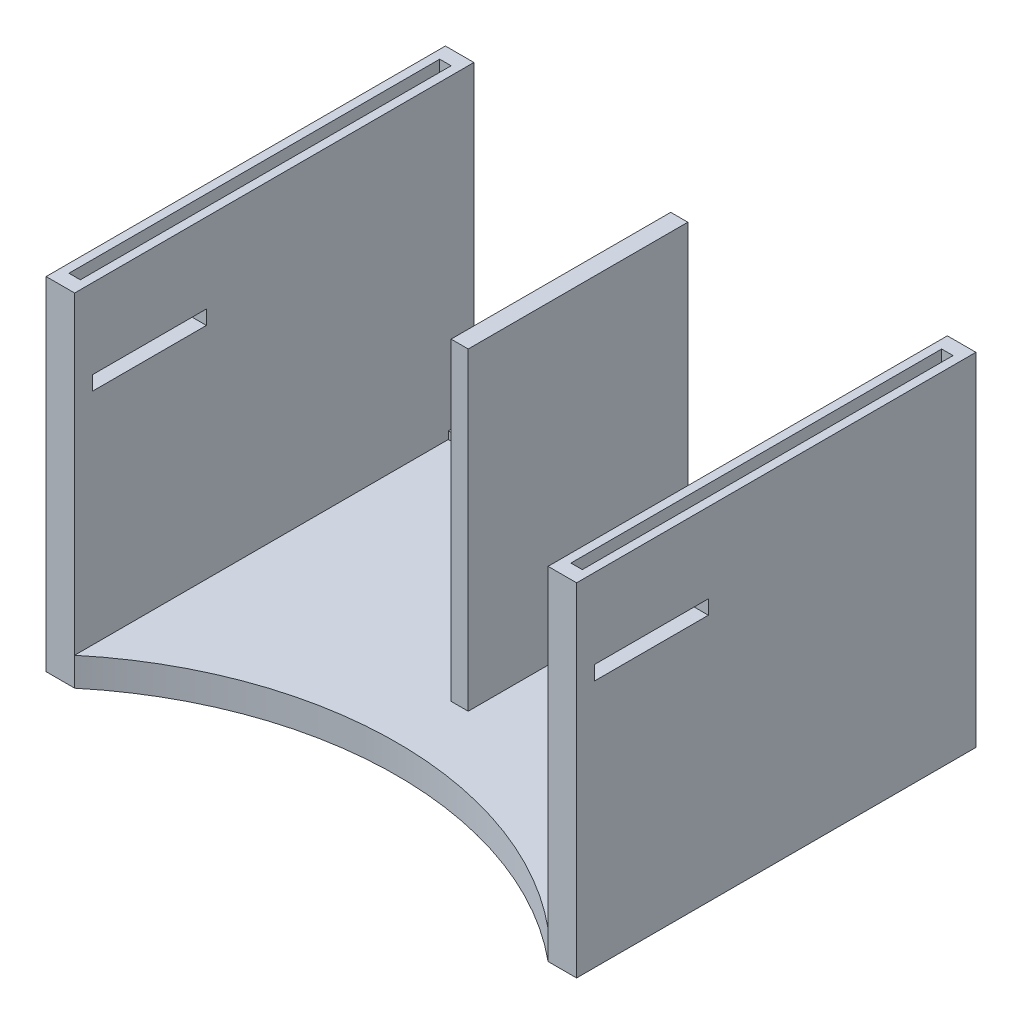
ISO-10303-21;
HEADER;
FILE_DESCRIPTION(('STEP AP214'),'2;1');
FILE_NAME('part.step','',(''),(''),'','','');
FILE_SCHEMA(('AUTOMOTIVE_DESIGN { 1 0 10303 214 1 1 1 1 }'));
ENDSEC;
DATA;
#1=APPLICATION_CONTEXT('core data for automotive mechanical design processes');
#2=APPLICATION_PROTOCOL_DEFINITION('international standard','automotive_design',2000,#1);
#3=PRODUCT_CONTEXT('',#1,'mechanical');
#4=PRODUCT('Part','Part','',(#3));
#5=PRODUCT_RELATED_PRODUCT_CATEGORY('part','',(#4));
#6=PRODUCT_DEFINITION_FORMATION('','',#4);
#7=PRODUCT_DEFINITION_CONTEXT('part definition',#1,'design');
#8=PRODUCT_DEFINITION('design','',#6,#7);
#9=PRODUCT_DEFINITION_SHAPE('','',#8);
#10=(LENGTH_UNIT() NAMED_UNIT(*) SI_UNIT(.MILLI.,.METRE.));
#11=(NAMED_UNIT(*) PLANE_ANGLE_UNIT() SI_UNIT($,.RADIAN.));
#12=(NAMED_UNIT(*) SI_UNIT($,.STERADIAN.) SOLID_ANGLE_UNIT());
#13=UNCERTAINTY_MEASURE_WITH_UNIT(LENGTH_MEASURE(1.E-05),#10,'distance_accuracy_value','');
#14=(GEOMETRIC_REPRESENTATION_CONTEXT(3) GLOBAL_UNCERTAINTY_ASSIGNED_CONTEXT((#13)) GLOBAL_UNIT_ASSIGNED_CONTEXT((#10,
#11,#12)) REPRESENTATION_CONTEXT('',''));
#15=CARTESIAN_POINT('',(0.,0.,0.));
#16=DIRECTION('',(0.,0.,1.));
#17=DIRECTION('',(1.,0.,0.));
#18=AXIS2_PLACEMENT_3D('',#15,#16,#17);
#19=CARTESIAN_POINT('',(0.,10.,140.));
#20=DIRECTION('',(0.,-1.,0.));
#21=DIRECTION('',(0.,0.,-1.));
#22=AXIS2_PLACEMENT_3D('',#19,#20,#21);
#23=PLANE('',#22);
#24=DIRECTION('',(0.,0.,-1.));
#25=VECTOR('',#24,1.);
#26=CARTESIAN_POINT('',(10.,10.,140.));
#27=LINE('',#26,#25);
#28=CARTESIAN_POINT('',(10.,10.,140.));
#29=VERTEX_POINT('',#28);
#30=CARTESIAN_POINT('',(10.,10.,9.00000000000001));
#31=VERTEX_POINT('',#30);
#32=EDGE_CURVE('E486',#29,#31,#27,.T.);
#33=ORIENTED_EDGE('',*,*,#32,.F.);
#34=CARTESIAN_POINT('',(93.,10.,239.816666666667));
#35=DIRECTION('',(0.,1.,0.));
#36=DIRECTION('',(0.,0.,-1.));
#37=AXIS2_PLACEMENT_3D('',#34,#35,#36);
#38=CIRCLE('',#37,129.816666666667);
#39=CARTESIAN_POINT('',(176.,10.,140.));
#40=VERTEX_POINT('',#39);
#41=EDGE_CURVE('E333',#40,#29,#38,.T.);
#42=ORIENTED_EDGE('',*,*,#41,.F.);
#43=DIRECTION('',(0.,0.,-1.));
#44=VECTOR('',#43,1.);
#45=CARTESIAN_POINT('',(176.,10.,140.));
#46=LINE('',#45,#44);
#47=CARTESIAN_POINT('',(176.,10.,9.00000000000001));
#48=VERTEX_POINT('',#47);
#49=EDGE_CURVE('E490',#40,#48,#46,.T.);
#50=ORIENTED_EDGE('',*,*,#49,.T.);
#51=DIRECTION('',(1.,0.,0.));
#52=VECTOR('',#51,1.);
#53=CARTESIAN_POINT('',(10.,10.,9.));
#54=LINE('',#53,#52);
#55=EDGE_CURVE('E411',#31,#48,#54,.T.);
#56=ORIENTED_EDGE('',*,*,#55,.F.);
#57=EDGE_LOOP('',(#33,#42,#50,#56));
#58=FACE_BOUND('',#57,.T.);
#59=DIRECTION('',(0.,0.,1.));
#60=VECTOR('',#59,1.);
#61=CARTESIAN_POINT('',(90.,10.,11.));
#62=LINE('',#61,#60);
#63=CARTESIAN_POINT('',(90.,10.,11.));
#64=VERTEX_POINT('',#63);
#65=CARTESIAN_POINT('',(90.,10.,88.));
#66=VERTEX_POINT('',#65);
#67=EDGE_CURVE('E269',#64,#66,#62,.T.);
#68=ORIENTED_EDGE('',*,*,#67,.F.);
#69=DIRECTION('',(-1.,0.,0.));
#70=VECTOR('',#69,1.);
#71=CARTESIAN_POINT('',(90.,10.,11.));
#72=LINE('',#71,#70);
#73=CARTESIAN_POINT('',(96.,10.,11.));
#74=VERTEX_POINT('',#73);
#75=EDGE_CURVE('E266',#74,#64,#72,.T.);
#76=ORIENTED_EDGE('',*,*,#75,.F.);
#77=DIRECTION('',(0.,0.,-1.));
#78=VECTOR('',#77,1.);
#79=CARTESIAN_POINT('',(96.,10.,11.));
#80=LINE('',#79,#78);
#81=CARTESIAN_POINT('',(96.,10.,88.));
#82=VERTEX_POINT('',#81);
#83=EDGE_CURVE('E55',#82,#74,#80,.T.);
#84=ORIENTED_EDGE('',*,*,#83,.F.);
#85=DIRECTION('',(1.,0.,0.));
#86=VECTOR('',#85,1.);
#87=CARTESIAN_POINT('',(90.,10.,88.));
#88=LINE('',#87,#86);
#89=EDGE_CURVE('E50',#66,#82,#88,.T.);
#90=ORIENTED_EDGE('',*,*,#89,.F.);
#91=EDGE_LOOP('',(#68,#76,#84,#90));
#92=FACE_BOUND('',#91,.T.);
#93=ADVANCED_FACE('F35',(#58,#92),#23,.F.);
#94=CARTESIAN_POINT('',(0.,0.,140.));
#95=DIRECTION('',(0.,0.,-1.));
#96=DIRECTION('',(-1.,0.,0.));
#97=AXIS2_PLACEMENT_3D('',#94,#95,#96);
#98=PLANE('',#97);
#99=DIRECTION('',(-1.,0.,0.));
#100=VECTOR('',#99,1.);
#101=CARTESIAN_POINT('',(0.,0.,140.));
#102=LINE('',#101,#100);
#103=CARTESIAN_POINT('',(10.,0.,140.));
#104=VERTEX_POINT('',#103);
#105=CARTESIAN_POINT('',(0.,0.,140.));
#106=VERTEX_POINT('',#105);
#107=EDGE_CURVE('E450',#104,#106,#102,.T.);
#108=ORIENTED_EDGE('',*,*,#107,.F.);
#109=DIRECTION('',(0.,1.,0.));
#110=VECTOR('',#109,1.);
#111=CARTESIAN_POINT('',(10.,0.,140.));
#112=LINE('',#111,#110);
#113=EDGE_CURVE('E343',#104,#29,#112,.T.);
#114=ORIENTED_EDGE('',*,*,#113,.T.);
#115=DIRECTION('',(0.,1.,0.));
#116=VECTOR('',#115,1.);
#117=CARTESIAN_POINT('',(10.,0.,140.));
#118=LINE('',#117,#116);
#119=CARTESIAN_POINT('',(10.,120.,140.));
#120=VERTEX_POINT('',#119);
#121=EDGE_CURVE('E441',#29,#120,#118,.T.);
#122=ORIENTED_EDGE('',*,*,#121,.T.);
#123=DIRECTION('',(1.,0.,0.));
#124=VECTOR('',#123,1.);
#125=CARTESIAN_POINT('',(0.,120.,140.));
#126=LINE('',#125,#124);
#127=CARTESIAN_POINT('',(0.,120.,140.));
#128=VERTEX_POINT('',#127);
#129=EDGE_CURVE('E443',#128,#120,#126,.T.);
#130=ORIENTED_EDGE('',*,*,#129,.F.);
#131=DIRECTION('',(0.,1.,0.));
#132=VECTOR('',#131,1.);
#133=CARTESIAN_POINT('',(0.,0.,140.));
#134=LINE('',#133,#132);
#135=EDGE_CURVE('E447',#106,#128,#134,.T.);
#136=ORIENTED_EDGE('',*,*,#135,.F.);
#137=EDGE_LOOP('',(#108,#114,#122,#130,#136));
#138=FACE_BOUND('',#137,.T.);
#139=ADVANCED_FACE('F520',(#138),#98,.F.);
#140=CARTESIAN_POINT('',(10.,0.,140.));
#141=DIRECTION('',(-1.,0.,0.));
#142=DIRECTION('',(0.,0.,1.));
#143=AXIS2_PLACEMENT_3D('',#140,#141,#142);
#144=PLANE('',#143);
#145=DIRECTION('',(0.,0.,1.));
#146=VECTOR('',#145,1.);
#147=CARTESIAN_POINT('',(10.,87.0515998992184,140.));
#148=LINE('',#147,#146);
#149=CARTESIAN_POINT('',(10.,87.0515998992184,93.7950113378685));
#150=VERTEX_POINT('',#149);
#151=CARTESIAN_POINT('',(10.,87.0515998992184,133.795011337868));
#152=VERTEX_POINT('',#151);
#153=EDGE_CURVE('E390',#150,#152,#148,.T.);
#154=ORIENTED_EDGE('',*,*,#153,.T.);
#155=DIRECTION('',(0.,1.,0.));
#156=VECTOR('',#155,1.);
#157=CARTESIAN_POINT('',(10.,0.,133.795011337868));
#158=LINE('',#157,#156);
#159=CARTESIAN_POINT('',(10.,92.0515998992184,133.795011337868));
#160=VERTEX_POINT('',#159);
#161=EDGE_CURVE('E408',#152,#160,#158,.T.);
#162=ORIENTED_EDGE('',*,*,#161,.T.);
#163=DIRECTION('',(0.,0.,-1.));
#164=VECTOR('',#163,1.);
#165=CARTESIAN_POINT('',(10.,92.0515998992184,140.));
#166=LINE('',#165,#164);
#167=CARTESIAN_POINT('',(10.,92.0515998992184,93.7950113378685));
#168=VERTEX_POINT('',#167);
#169=EDGE_CURVE('E402',#160,#168,#166,.T.);
#170=ORIENTED_EDGE('',*,*,#169,.T.);
#171=DIRECTION('',(0.,-1.,0.));
#172=VECTOR('',#171,1.);
#173=CARTESIAN_POINT('',(10.,0.,93.7950113378685));
#174=LINE('',#173,#172);
#175=EDGE_CURVE('E396',#168,#150,#174,.T.);
#176=ORIENTED_EDGE('',*,*,#175,.T.);
#177=EDGE_LOOP('',(#154,#162,#170,#176));
#178=FACE_BOUND('',#177,.T.);
#179=DIRECTION('',(0.,-1.,0.));
#180=VECTOR('',#179,1.);
#181=CARTESIAN_POINT('',(10.,12.6416,9.));
#182=LINE('',#181,#180);
#183=CARTESIAN_POINT('',(10.,12.6416,9.00000000000001));
#184=VERTEX_POINT('',#183);
#185=EDGE_CURVE('E437',#184,#31,#182,.T.);
#186=ORIENTED_EDGE('',*,*,#185,.F.);
#187=DIRECTION('',(0.,0.,1.));
#188=VECTOR('',#187,1.);
#189=CARTESIAN_POINT('',(10.,12.6416,4.));
#190=LINE('',#189,#188);
#191=CARTESIAN_POINT('',(10.,12.6416,4.));
#192=VERTEX_POINT('',#191);
#193=EDGE_CURVE('E412',#192,#184,#190,.T.);
#194=ORIENTED_EDGE('',*,*,#193,.F.);
#195=DIRECTION('',(0.,-1.,0.));
#196=VECTOR('',#195,1.);
#197=CARTESIAN_POINT('',(10.,12.6416,4.));
#198=LINE('',#197,#196);
#199=CARTESIAN_POINT('',(10.,10.,4.));
#200=VERTEX_POINT('',#199);
#201=EDGE_CURVE('E425',#192,#200,#198,.T.);
#202=ORIENTED_EDGE('',*,*,#201,.T.);
#203=CARTESIAN_POINT('',(10.,10.,0.));
#204=VERTEX_POINT('',#203);
#205=EDGE_CURVE('E463',#200,#204,#27,.T.);
#206=ORIENTED_EDGE('',*,*,#205,.T.);
#207=DIRECTION('',(0.,1.,0.));
#208=VECTOR('',#207,1.);
#209=CARTESIAN_POINT('',(10.,0.,0.));
#210=LINE('',#209,#208);
#211=CARTESIAN_POINT('',(10.,120.,0.));
#212=VERTEX_POINT('',#211);
#213=EDGE_CURVE('E440',#204,#212,#210,.T.);
#214=ORIENTED_EDGE('',*,*,#213,.T.);
#215=DIRECTION('',(0.,0.,-1.));
#216=VECTOR('',#215,1.);
#217=CARTESIAN_POINT('',(10.,120.,140.));
#218=LINE('',#217,#216);
#219=EDGE_CURVE('E11',#120,#212,#218,.T.);
#220=ORIENTED_EDGE('',*,*,#219,.F.);
#221=ORIENTED_EDGE('',*,*,#121,.F.);
#222=ORIENTED_EDGE('',*,*,#32,.T.);
#223=EDGE_LOOP('',(#186,#194,#202,#206,#214,#220,#221,#222));
#224=FACE_BOUND('',#223,.T.);
#225=ADVANCED_FACE('F37',(#178,#224),#144,.F.);
#226=CARTESIAN_POINT('',(176.,0.,140.));
#227=DIRECTION('',(1.,0.,0.));
#228=DIRECTION('',(0.,0.,-1.));
#229=AXIS2_PLACEMENT_3D('',#226,#227,#228);
#230=PLANE('',#229);
#231=DIRECTION('',(0.,0.,1.));
#232=VECTOR('',#231,1.);
#233=CARTESIAN_POINT('',(176.,92.0515998992184,140.));
#234=LINE('',#233,#232);
#235=CARTESIAN_POINT('',(176.,92.0515998992184,93.7950113378685));
#236=VERTEX_POINT('',#235);
#237=CARTESIAN_POINT('',(176.,92.0515998992184,133.795011337868));
#238=VERTEX_POINT('',#237);
#239=EDGE_CURVE('E399',#236,#238,#234,.T.);
#240=ORIENTED_EDGE('',*,*,#239,.T.);
#241=DIRECTION('',(0.,-1.,0.));
#242=VECTOR('',#241,1.);
#243=CARTESIAN_POINT('',(176.,0.,133.795011337868));
#244=LINE('',#243,#242);
#245=CARTESIAN_POINT('',(176.,87.0515998992184,133.795011337868));
#246=VERTEX_POINT('',#245);
#247=EDGE_CURVE('E405',#238,#246,#244,.T.);
#248=ORIENTED_EDGE('',*,*,#247,.T.);
#249=DIRECTION('',(0.,0.,-1.));
#250=VECTOR('',#249,1.);
#251=CARTESIAN_POINT('',(176.,87.0515998992184,140.));
#252=LINE('',#251,#250);
#253=CARTESIAN_POINT('',(176.,87.0515998992184,93.7950113378685));
#254=VERTEX_POINT('',#253);
#255=EDGE_CURVE('E376',#246,#254,#252,.T.);
#256=ORIENTED_EDGE('',*,*,#255,.T.);
#257=DIRECTION('',(0.,1.,0.));
#258=VECTOR('',#257,1.);
#259=CARTESIAN_POINT('',(176.,0.,93.7950113378685));
#260=LINE('',#259,#258);
#261=EDGE_CURVE('E393',#254,#236,#260,.T.);
#262=ORIENTED_EDGE('',*,*,#261,.T.);
#263=EDGE_LOOP('',(#240,#248,#256,#262));
#264=FACE_BOUND('',#263,.T.);
#265=DIRECTION('',(0.,-1.,0.));
#266=VECTOR('',#265,1.);
#267=CARTESIAN_POINT('',(176.,12.6416,9.00000000000001));
#268=LINE('',#267,#266);
#269=CARTESIAN_POINT('',(176.,12.6416,9.00000000000001));
#270=VERTEX_POINT('',#269);
#271=EDGE_CURVE('E435',#270,#48,#268,.T.);
#272=ORIENTED_EDGE('',*,*,#271,.T.);
#273=ORIENTED_EDGE('',*,*,#49,.F.);
#274=DIRECTION('',(0.,1.,0.));
#275=VECTOR('',#274,1.);
#276=CARTESIAN_POINT('',(176.,0.,140.));
#277=LINE('',#276,#275);
#278=CARTESIAN_POINT('',(176.,120.,140.));
#279=VERTEX_POINT('',#278);
#280=EDGE_CURVE('E460',#279,#40,#277,.F.);
#281=ORIENTED_EDGE('',*,*,#280,.F.);
#282=DIRECTION('',(0.,0.,-1.));
#283=VECTOR('',#282,1.);
#284=CARTESIAN_POINT('',(176.,120.,140.));
#285=LINE('',#284,#283);
#286=CARTESIAN_POINT('',(176.,120.,0.));
#287=VERTEX_POINT('',#286);
#288=EDGE_CURVE('E493',#279,#287,#285,.T.);
#289=ORIENTED_EDGE('',*,*,#288,.T.);
#290=DIRECTION('',(0.,1.,0.));
#291=VECTOR('',#290,1.);
#292=CARTESIAN_POINT('',(176.,0.,0.));
#293=LINE('',#292,#291);
#294=CARTESIAN_POINT('',(176.,10.,0.));
#295=VERTEX_POINT('',#294);
#296=EDGE_CURVE('E481',#287,#295,#293,.F.);
#297=ORIENTED_EDGE('',*,*,#296,.T.);
#298=CARTESIAN_POINT('',(176.,10.,4.));
#299=VERTEX_POINT('',#298);
#300=EDGE_CURVE('E489',#299,#295,#46,.T.);
#301=ORIENTED_EDGE('',*,*,#300,.F.);
#302=DIRECTION('',(0.,-1.,0.));
#303=VECTOR('',#302,1.);
#304=CARTESIAN_POINT('',(176.,12.6416,4.));
#305=LINE('',#304,#303);
#306=CARTESIAN_POINT('',(176.,12.6416,4.));
#307=VERTEX_POINT('',#306);
#308=EDGE_CURVE('E432',#307,#299,#305,.T.);
#309=ORIENTED_EDGE('',*,*,#308,.F.);
#310=DIRECTION('',(0.,0.,-1.));
#311=VECTOR('',#310,1.);
#312=CARTESIAN_POINT('',(176.,12.6416,4.));
#313=LINE('',#312,#311);
#314=EDGE_CURVE('E419',#270,#307,#313,.T.);
#315=ORIENTED_EDGE('',*,*,#314,.F.);
#316=EDGE_LOOP('',(#272,#273,#281,#289,#297,#301,#309,#315));
#317=FACE_BOUND('',#316,.T.);
#318=ADVANCED_FACE('F531',(#264,#317),#230,.F.);
#319=DIRECTION('',(-1.,0.,0.));
#320=VECTOR('',#319,1.);
#321=CARTESIAN_POINT('',(10.,10.,4.));
#322=LINE('',#321,#320);
#323=EDGE_CURVE('E416',#299,#200,#322,.T.);
#324=ORIENTED_EDGE('',*,*,#323,.F.);
#325=ORIENTED_EDGE('',*,*,#300,.T.);
#326=DIRECTION('',(1.,0.,0.));
#327=VECTOR('',#326,1.);
#328=CARTESIAN_POINT('',(0.,10.,0.));
#329=LINE('',#328,#327);
#330=EDGE_CURVE('E444',#295,#204,#329,.F.);
#331=ORIENTED_EDGE('',*,*,#330,.T.);
#332=ORIENTED_EDGE('',*,*,#205,.F.);
#333=EDGE_LOOP('',(#324,#325,#331,#332));
#334=FACE_BOUND('',#333,.T.);
#335=ADVANCED_FACE('F528',(#334),#23,.F.);
#336=CARTESIAN_POINT('',(0.,120.,140.));
#337=DIRECTION('',(0.,1.,0.));
#338=DIRECTION('',(0.,0.,1.));
#339=AXIS2_PLACEMENT_3D('',#336,#337,#338);
#340=PLANE('',#339);
#341=DIRECTION('',(0.,0.,1.));
#342=VECTOR('',#341,1.);
#343=CARTESIAN_POINT('',(3.,120.,5.));
#344=LINE('',#343,#342);
#345=CARTESIAN_POINT('',(3.,120.,5.));
#346=VERTEX_POINT('',#345);
#347=CARTESIAN_POINT('',(3.00000000000002,120.,135.));
#348=VERTEX_POINT('',#347);
#349=EDGE_CURVE('E301',#346,#348,#344,.T.);
#350=ORIENTED_EDGE('',*,*,#349,.F.);
#351=DIRECTION('',(-1.,0.,0.));
#352=VECTOR('',#351,1.);
#353=CARTESIAN_POINT('',(3.,120.,5.));
#354=LINE('',#353,#352);
#355=CARTESIAN_POINT('',(7.,120.,5.));
#356=VERTEX_POINT('',#355);
#357=EDGE_CURVE('E312',#356,#346,#354,.T.);
#358=ORIENTED_EDGE('',*,*,#357,.F.);
#359=DIRECTION('',(0.,0.,-1.));
#360=VECTOR('',#359,1.);
#361=CARTESIAN_POINT('',(7.,120.,5.));
#362=LINE('',#361,#360);
#363=CARTESIAN_POINT('',(7.00000000000002,120.,135.));
#364=VERTEX_POINT('',#363);
#365=EDGE_CURVE('E326',#364,#356,#362,.T.);
#366=ORIENTED_EDGE('',*,*,#365,.F.);
#367=DIRECTION('',(1.,0.,0.));
#368=VECTOR('',#367,1.);
#369=CARTESIAN_POINT('',(3.00000000000002,120.,135.));
#370=LINE('',#369,#368);
#371=EDGE_CURVE('E323',#348,#364,#370,.T.);
#372=ORIENTED_EDGE('',*,*,#371,.F.);
#373=EDGE_LOOP('',(#350,#358,#366,#372));
#374=FACE_BOUND('',#373,.T.);
#375=DIRECTION('',(1.,0.,0.));
#376=VECTOR('',#375,1.);
#377=CARTESIAN_POINT('',(0.,120.,0.));
#378=LINE('',#377,#376);
#379=CARTESIAN_POINT('',(0.,120.,0.));
#380=VERTEX_POINT('',#379);
#381=EDGE_CURVE('E466',#380,#212,#378,.T.);
#382=ORIENTED_EDGE('',*,*,#381,.F.);
#383=DIRECTION('',(0.,0.,-1.));
#384=VECTOR('',#383,1.);
#385=CARTESIAN_POINT('',(0.,120.,140.));
#386=LINE('',#385,#384);
#387=EDGE_CURVE('E43',#128,#380,#386,.T.);
#388=ORIENTED_EDGE('',*,*,#387,.F.);
#389=ORIENTED_EDGE('',*,*,#129,.T.);
#390=ORIENTED_EDGE('',*,*,#219,.T.);
#391=EDGE_LOOP('',(#382,#388,#389,#390));
#392=FACE_BOUND('',#391,.T.);
#393=ADVANCED_FACE('F508',(#374,#392),#340,.T.);
#394=CARTESIAN_POINT('',(0.,0.,140.));
#395=DIRECTION('',(-1.,0.,0.));
#396=DIRECTION('',(0.,0.,1.));
#397=AXIS2_PLACEMENT_3D('',#394,#395,#396);
#398=PLANE('',#397);
#399=DIRECTION('',(0.,-1.,0.));
#400=VECTOR('',#399,1.);
#401=CARTESIAN_POINT('',(0.,92.0515998992184,133.795011337868));
#402=LINE('',#401,#400);
#403=CARTESIAN_POINT('',(0.,92.0515998992184,133.795011337868));
#404=VERTEX_POINT('',#403);
#405=CARTESIAN_POINT('',(0.,87.0515998992184,133.795011337868));
#406=VERTEX_POINT('',#405);
#407=EDGE_CURVE('E360',#404,#406,#402,.T.);
#408=ORIENTED_EDGE('',*,*,#407,.T.);
#409=DIRECTION('',(0.,0.,-1.));
#410=VECTOR('',#409,1.);
#411=CARTESIAN_POINT('',(0.,87.0515998992184,133.795011337868));
#412=LINE('',#411,#410);
#413=CARTESIAN_POINT('',(0.,87.0515998992184,93.7950113378685));
#414=VERTEX_POINT('',#413);
#415=EDGE_CURVE('E363',#406,#414,#412,.T.);
#416=ORIENTED_EDGE('',*,*,#415,.T.);
#417=DIRECTION('',(0.,1.,0.));
#418=VECTOR('',#417,1.);
#419=CARTESIAN_POINT('',(0.,92.0515998992184,93.7950113378685));
#420=LINE('',#419,#418);
#421=CARTESIAN_POINT('',(0.,92.0515998992184,93.7950113378685));
#422=VERTEX_POINT('',#421);
#423=EDGE_CURVE('E366',#414,#422,#420,.T.);
#424=ORIENTED_EDGE('',*,*,#423,.T.);
#425=DIRECTION('',(0.,0.,1.));
#426=VECTOR('',#425,1.);
#427=CARTESIAN_POINT('',(0.,92.0515998992184,133.795011337868));
#428=LINE('',#427,#426);
#429=EDGE_CURVE('E369',#422,#404,#428,.T.);
#430=ORIENTED_EDGE('',*,*,#429,.T.);
#431=EDGE_LOOP('',(#408,#416,#424,#430));
#432=FACE_BOUND('',#431,.T.);
#433=DIRECTION('',(0.,1.,0.));
#434=VECTOR('',#433,1.);
#435=CARTESIAN_POINT('',(0.,0.,0.));
#436=LINE('',#435,#434);
#437=CARTESIAN_POINT('',(0.,0.,0.));
#438=VERTEX_POINT('',#437);
#439=EDGE_CURVE('E469',#438,#380,#436,.T.);
#440=ORIENTED_EDGE('',*,*,#439,.F.);
#441=DIRECTION('',(0.,0.,-1.));
#442=VECTOR('',#441,1.);
#443=CARTESIAN_POINT('',(0.,0.,140.));
#444=LINE('',#443,#442);
#445=EDGE_CURVE('E499',#106,#438,#444,.T.);
#446=ORIENTED_EDGE('',*,*,#445,.F.);
#447=ORIENTED_EDGE('',*,*,#135,.T.);
#448=ORIENTED_EDGE('',*,*,#387,.T.);
#449=EDGE_LOOP('',(#440,#446,#447,#448));
#450=FACE_BOUND('',#449,.T.);
#451=ADVANCED_FACE('F503',(#432,#450),#398,.T.);
#452=CARTESIAN_POINT('',(0.,0.,140.));
#453=DIRECTION('',(0.,-1.,0.));
#454=DIRECTION('',(0.,0.,-1.));
#455=AXIS2_PLACEMENT_3D('',#452,#453,#454);
#456=PLANE('',#455);
#457=CARTESIAN_POINT('',(93.,0.,239.816666666667));
#458=DIRECTION('',(0.,1.,0.));
#459=DIRECTION('',(0.,0.,-1.));
#460=AXIS2_PLACEMENT_3D('',#457,#458,#459);
#461=CIRCLE('',#460,129.816666666667);
#462=CARTESIAN_POINT('',(176.,0.,140.));
#463=VERTEX_POINT('',#462);
#464=EDGE_CURVE('E340',#463,#104,#461,.T.);
#465=ORIENTED_EDGE('',*,*,#464,.T.);
#466=ORIENTED_EDGE('',*,*,#107,.T.);
#467=ORIENTED_EDGE('',*,*,#445,.T.);
#468=DIRECTION('',(-1.,0.,0.));
#469=VECTOR('',#468,1.);
#470=CARTESIAN_POINT('',(0.,0.,0.));
#471=LINE('',#470,#469);
#472=CARTESIAN_POINT('',(186.,0.,0.));
#473=VERTEX_POINT('',#472);
#474=EDGE_CURVE('E472',#473,#438,#471,.T.);
#475=ORIENTED_EDGE('',*,*,#474,.F.);
#476=DIRECTION('',(0.,0.,-1.));
#477=VECTOR('',#476,1.);
#478=CARTESIAN_POINT('',(186.,0.,140.));
#479=LINE('',#478,#477);
#480=CARTESIAN_POINT('',(186.,0.,140.));
#481=VERTEX_POINT('',#480);
#482=EDGE_CURVE('E497',#481,#473,#479,.T.);
#483=ORIENTED_EDGE('',*,*,#482,.F.);
#484=EDGE_CURVE('E451',#481,#463,#102,.T.);
#485=ORIENTED_EDGE('',*,*,#484,.T.);
#486=EDGE_LOOP('',(#465,#466,#467,#475,#483,#485));
#487=FACE_BOUND('',#486,.T.);
#488=ADVANCED_FACE('F516',(#487),#456,.T.);
#489=CARTESIAN_POINT('',(186.,0.,140.));
#490=DIRECTION('',(1.,0.,0.));
#491=DIRECTION('',(0.,0.,-1.));
#492=AXIS2_PLACEMENT_3D('',#489,#490,#491);
#493=PLANE('',#492);
#494=DIRECTION('',(0.,-1.,0.));
#495=VECTOR('',#494,1.);
#496=CARTESIAN_POINT('',(186.,92.0515998992184,133.795011337868));
#497=LINE('',#496,#495);
#498=CARTESIAN_POINT('',(186.,92.0515998992184,133.795011337868));
#499=VERTEX_POINT('',#498);
#500=CARTESIAN_POINT('',(186.,87.0515998992184,133.795011337868));
#501=VERTEX_POINT('',#500);
#502=EDGE_CURVE('E347',#499,#501,#497,.T.);
#503=ORIENTED_EDGE('',*,*,#502,.F.);
#504=DIRECTION('',(0.,0.,1.));
#505=VECTOR('',#504,1.);
#506=CARTESIAN_POINT('',(186.,92.0515998992184,133.795011337868));
#507=LINE('',#506,#505);
#508=CARTESIAN_POINT('',(186.,92.0515998992184,93.7950113378685));
#509=VERTEX_POINT('',#508);
#510=EDGE_CURVE('E357',#509,#499,#507,.T.);
#511=ORIENTED_EDGE('',*,*,#510,.F.);
#512=DIRECTION('',(0.,1.,0.));
#513=VECTOR('',#512,1.);
#514=CARTESIAN_POINT('',(186.,92.0515998992184,93.7950113378685));
#515=LINE('',#514,#513);
#516=CARTESIAN_POINT('',(186.,87.0515998992184,93.7950113378685));
#517=VERTEX_POINT('',#516);
#518=EDGE_CURVE('E354',#517,#509,#515,.T.);
#519=ORIENTED_EDGE('',*,*,#518,.F.);
#520=DIRECTION('',(0.,0.,-1.));
#521=VECTOR('',#520,1.);
#522=CARTESIAN_POINT('',(186.,87.0515998992184,133.795011337868));
#523=LINE('',#522,#521);
#524=EDGE_CURVE('E351',#501,#517,#523,.T.);
#525=ORIENTED_EDGE('',*,*,#524,.F.);
#526=EDGE_LOOP('',(#503,#511,#519,#525));
#527=FACE_BOUND('',#526,.T.);
#528=DIRECTION('',(0.,-1.,0.));
#529=VECTOR('',#528,1.);
#530=CARTESIAN_POINT('',(186.,0.,0.));
#531=LINE('',#530,#529);
#532=CARTESIAN_POINT('',(186.,120.,0.));
#533=VERTEX_POINT('',#532);
#534=EDGE_CURVE('E475',#533,#473,#531,.T.);
#535=ORIENTED_EDGE('',*,*,#534,.F.);
#536=DIRECTION('',(0.,0.,-1.));
#537=VECTOR('',#536,1.);
#538=CARTESIAN_POINT('',(186.,120.,140.));
#539=LINE('',#538,#537);
#540=CARTESIAN_POINT('',(186.,120.,140.));
#541=VERTEX_POINT('',#540);
#542=EDGE_CURVE('E495',#541,#533,#539,.T.);
#543=ORIENTED_EDGE('',*,*,#542,.F.);
#544=DIRECTION('',(0.,-1.,0.));
#545=VECTOR('',#544,1.);
#546=CARTESIAN_POINT('',(186.,0.,140.));
#547=LINE('',#546,#545);
#548=EDGE_CURVE('E454',#541,#481,#547,.T.);
#549=ORIENTED_EDGE('',*,*,#548,.T.);
#550=ORIENTED_EDGE('',*,*,#482,.T.);
#551=EDGE_LOOP('',(#535,#543,#549,#550));
#552=FACE_BOUND('',#551,.T.);
#553=ADVANCED_FACE('F539',(#527,#552),#493,.T.);
#554=CARTESIAN_POINT('',(176.,120.,140.));
#555=DIRECTION('',(0.,1.,0.));
#556=DIRECTION('',(0.,0.,1.));
#557=AXIS2_PLACEMENT_3D('',#554,#555,#556);
#558=PLANE('',#557);
#559=DIRECTION('',(0.,0.,1.));
#560=VECTOR('',#559,1.);
#561=CARTESIAN_POINT('',(179.,120.,5.));
#562=LINE('',#561,#560);
#563=CARTESIAN_POINT('',(179.,120.,5.));
#564=VERTEX_POINT('',#563);
#565=CARTESIAN_POINT('',(179.,120.,135.));
#566=VERTEX_POINT('',#565);
#567=EDGE_CURVE('E270',#564,#566,#562,.T.);
#568=ORIENTED_EDGE('',*,*,#567,.F.);
#569=DIRECTION('',(-1.,0.,0.));
#570=VECTOR('',#569,1.);
#571=CARTESIAN_POINT('',(179.,120.,5.));
#572=LINE('',#571,#570);
#573=CARTESIAN_POINT('',(183.,120.,5.));
#574=VERTEX_POINT('',#573);
#575=EDGE_CURVE('E282',#574,#564,#572,.T.);
#576=ORIENTED_EDGE('',*,*,#575,.F.);
#577=DIRECTION('',(0.,0.,-1.));
#578=VECTOR('',#577,1.);
#579=CARTESIAN_POINT('',(183.,120.,5.));
#580=LINE('',#579,#578);
#581=CARTESIAN_POINT('',(183.,120.,135.));
#582=VERTEX_POINT('',#581);
#583=EDGE_CURVE('E294',#582,#574,#580,.T.);
#584=ORIENTED_EDGE('',*,*,#583,.F.);
#585=DIRECTION('',(1.,0.,0.));
#586=VECTOR('',#585,1.);
#587=CARTESIAN_POINT('',(179.,120.,135.));
#588=LINE('',#587,#586);
#589=EDGE_CURVE('E272',#566,#582,#588,.T.);
#590=ORIENTED_EDGE('',*,*,#589,.F.);
#591=EDGE_LOOP('',(#568,#576,#584,#590));
#592=FACE_BOUND('',#591,.T.);
#593=DIRECTION('',(1.,0.,0.));
#594=VECTOR('',#593,1.);
#595=CARTESIAN_POINT('',(176.,120.,0.));
#596=LINE('',#595,#594);
#597=EDGE_CURVE('E478',#287,#533,#596,.T.);
#598=ORIENTED_EDGE('',*,*,#597,.F.);
#599=ORIENTED_EDGE('',*,*,#288,.F.);
#600=DIRECTION('',(1.,0.,0.));
#601=VECTOR('',#600,1.);
#602=CARTESIAN_POINT('',(176.,120.,140.));
#603=LINE('',#602,#601);
#604=EDGE_CURVE('E457',#279,#541,#603,.T.);
#605=ORIENTED_EDGE('',*,*,#604,.T.);
#606=ORIENTED_EDGE('',*,*,#542,.T.);
#607=EDGE_LOOP('',(#598,#599,#605,#606));
#608=FACE_BOUND('',#607,.T.);
#609=ADVANCED_FACE('F536',(#592,#608),#558,.T.);
#610=ORIENTED_EDGE('',*,*,#280,.T.);
#611=DIRECTION('',(0.,1.,0.));
#612=VECTOR('',#611,1.);
#613=CARTESIAN_POINT('',(176.,0.,140.));
#614=LINE('',#613,#612);
#615=EDGE_CURVE('E345',#463,#40,#614,.T.);
#616=ORIENTED_EDGE('',*,*,#615,.F.);
#617=ORIENTED_EDGE('',*,*,#484,.F.);
#618=ORIENTED_EDGE('',*,*,#548,.F.);
#619=ORIENTED_EDGE('',*,*,#604,.F.);
#620=EDGE_LOOP('',(#610,#616,#617,#618,#619));
#621=FACE_BOUND('',#620,.T.);
#622=ADVANCED_FACE('F541',(#621),#98,.F.);
#623=CARTESIAN_POINT('',(0.,0.,0.));
#624=DIRECTION('',(0.,0.,-1.));
#625=DIRECTION('',(-1.,0.,0.));
#626=AXIS2_PLACEMENT_3D('',#623,#624,#625);
#627=PLANE('',#626);
#628=ORIENTED_EDGE('',*,*,#213,.F.);
#629=ORIENTED_EDGE('',*,*,#330,.F.);
#630=ORIENTED_EDGE('',*,*,#296,.F.);
#631=ORIENTED_EDGE('',*,*,#597,.T.);
#632=ORIENTED_EDGE('',*,*,#534,.T.);
#633=ORIENTED_EDGE('',*,*,#474,.T.);
#634=ORIENTED_EDGE('',*,*,#439,.T.);
#635=ORIENTED_EDGE('',*,*,#381,.T.);
#636=EDGE_LOOP('',(#628,#629,#630,#631,#632,#633,#634,#635));
#637=FACE_BOUND('',#636,.T.);
#638=ADVANCED_FACE('F512',(#637),#627,.T.);
#639=CARTESIAN_POINT('',(10.,12.6416,9.));
#640=DIRECTION('',(0.,0.,-1.));
#641=DIRECTION('',(-1.,0.,0.));
#642=AXIS2_PLACEMENT_3D('',#639,#640,#641);
#643=PLANE('',#642);
#644=ORIENTED_EDGE('',*,*,#55,.T.);
#645=ORIENTED_EDGE('',*,*,#271,.F.);
#646=DIRECTION('',(1.,0.,0.));
#647=VECTOR('',#646,1.);
#648=CARTESIAN_POINT('',(10.,12.6416,9.));
#649=LINE('',#648,#647);
#650=EDGE_CURVE('E415',#184,#270,#649,.T.);
#651=ORIENTED_EDGE('',*,*,#650,.F.);
#652=ORIENTED_EDGE('',*,*,#185,.T.);
#653=EDGE_LOOP('',(#644,#645,#651,#652));
#654=FACE_BOUND('',#653,.T.);
#655=ADVANCED_FACE('F550',(#654),#643,.F.);
#656=CARTESIAN_POINT('',(10.,12.6416,4.));
#657=DIRECTION('',(0.,0.,1.));
#658=DIRECTION('',(1.,0.,0.));
#659=AXIS2_PLACEMENT_3D('',#656,#657,#658);
#660=PLANE('',#659);
#661=ORIENTED_EDGE('',*,*,#323,.T.);
#662=ORIENTED_EDGE('',*,*,#201,.F.);
#663=DIRECTION('',(-1.,0.,0.));
#664=VECTOR('',#663,1.);
#665=CARTESIAN_POINT('',(10.,12.6416,4.));
#666=LINE('',#665,#664);
#667=EDGE_CURVE('E422',#307,#192,#666,.T.);
#668=ORIENTED_EDGE('',*,*,#667,.F.);
#669=ORIENTED_EDGE('',*,*,#308,.T.);
#670=EDGE_LOOP('',(#661,#662,#668,#669));
#671=FACE_BOUND('',#670,.T.);
#672=ADVANCED_FACE('F556',(#671),#660,.F.);
#673=CARTESIAN_POINT('',(0.,12.6416,0.));
#674=DIRECTION('',(0.,1.,0.));
#675=DIRECTION('',(0.,0.,1.));
#676=AXIS2_PLACEMENT_3D('',#673,#674,#675);
#677=PLANE('',#676);
#678=ORIENTED_EDGE('',*,*,#193,.T.);
#679=ORIENTED_EDGE('',*,*,#650,.T.);
#680=ORIENTED_EDGE('',*,*,#314,.T.);
#681=ORIENTED_EDGE('',*,*,#667,.T.);
#682=EDGE_LOOP('',(#678,#679,#680,#681));
#683=FACE_BOUND('',#682,.T.);
#684=ADVANCED_FACE('F554',(#683),#677,.T.);
#685=CARTESIAN_POINT('',(0.,87.0515998992184,133.795011337868));
#686=DIRECTION('',(0.,-1.,0.));
#687=DIRECTION('',(0.,0.,-1.));
#688=AXIS2_PLACEMENT_3D('',#685,#686,#687);
#689=PLANE('',#688);
#690=DIRECTION('',(1.,0.,0.));
#691=VECTOR('',#690,1.);
#692=CARTESIAN_POINT('',(0.,87.0515998992184,133.795011337868));
#693=LINE('',#692,#691);
#694=EDGE_CURVE('E372',#246,#501,#693,.T.);
#695=ORIENTED_EDGE('',*,*,#694,.T.);
#696=ORIENTED_EDGE('',*,*,#524,.T.);
#697=DIRECTION('',(1.,0.,0.));
#698=VECTOR('',#697,1.);
#699=CARTESIAN_POINT('',(0.,87.0515998992184,93.7950113378685));
#700=LINE('',#699,#698);
#701=EDGE_CURVE('E385',#254,#517,#700,.T.);
#702=ORIENTED_EDGE('',*,*,#701,.F.);
#703=ORIENTED_EDGE('',*,*,#255,.F.);
#704=EDGE_LOOP('',(#695,#696,#702,#703));
#705=FACE_BOUND('',#704,.T.);
#706=ADVANCED_FACE('F563',(#705),#689,.F.);
#707=CARTESIAN_POINT('',(0.,92.0515998992184,93.7950113378685));
#708=DIRECTION('',(0.,0.,-1.));
#709=DIRECTION('',(-1.,0.,0.));
#710=AXIS2_PLACEMENT_3D('',#707,#708,#709);
#711=PLANE('',#710);
#712=ORIENTED_EDGE('',*,*,#701,.T.);
#713=ORIENTED_EDGE('',*,*,#518,.T.);
#714=DIRECTION('',(1.,0.,0.));
#715=VECTOR('',#714,1.);
#716=CARTESIAN_POINT('',(0.,92.0515998992184,93.7950113378685));
#717=LINE('',#716,#715);
#718=EDGE_CURVE('E381',#236,#509,#717,.T.);
#719=ORIENTED_EDGE('',*,*,#718,.F.);
#720=ORIENTED_EDGE('',*,*,#261,.F.);
#721=EDGE_LOOP('',(#712,#713,#719,#720));
#722=FACE_BOUND('',#721,.T.);
#723=ADVANCED_FACE('F619',(#722),#711,.F.);
#724=CARTESIAN_POINT('',(0.,92.0515998992184,133.795011337868));
#725=DIRECTION('',(0.,1.,0.));
#726=DIRECTION('',(0.,0.,1.));
#727=AXIS2_PLACEMENT_3D('',#724,#725,#726);
#728=PLANE('',#727);
#729=ORIENTED_EDGE('',*,*,#718,.T.);
#730=ORIENTED_EDGE('',*,*,#510,.T.);
#731=DIRECTION('',(1.,0.,0.));
#732=VECTOR('',#731,1.);
#733=CARTESIAN_POINT('',(0.,92.0515998992184,133.795011337868));
#734=LINE('',#733,#732);
#735=EDGE_CURVE('E377',#238,#499,#734,.T.);
#736=ORIENTED_EDGE('',*,*,#735,.F.);
#737=ORIENTED_EDGE('',*,*,#239,.F.);
#738=EDGE_LOOP('',(#729,#730,#736,#737));
#739=FACE_BOUND('',#738,.T.);
#740=ADVANCED_FACE('F613',(#739),#728,.F.);
#741=CARTESIAN_POINT('',(0.,92.0515998992184,133.795011337868));
#742=DIRECTION('',(0.,0.,1.));
#743=DIRECTION('',(1.,0.,0.));
#744=AXIS2_PLACEMENT_3D('',#741,#742,#743);
#745=PLANE('',#744);
#746=ORIENTED_EDGE('',*,*,#735,.T.);
#747=ORIENTED_EDGE('',*,*,#502,.T.);
#748=ORIENTED_EDGE('',*,*,#694,.F.);
#749=ORIENTED_EDGE('',*,*,#247,.F.);
#750=EDGE_LOOP('',(#746,#747,#748,#749));
#751=FACE_BOUND('',#750,.T.);
#752=ADVANCED_FACE('F620',(#751),#745,.F.);
#753=EDGE_CURVE('E386',#406,#152,#693,.T.);
#754=ORIENTED_EDGE('',*,*,#753,.F.);
#755=ORIENTED_EDGE('',*,*,#407,.F.);
#756=EDGE_CURVE('E373',#404,#160,#734,.T.);
#757=ORIENTED_EDGE('',*,*,#756,.T.);
#758=ORIENTED_EDGE('',*,*,#161,.F.);
#759=EDGE_LOOP('',(#754,#755,#757,#758));
#760=FACE_BOUND('',#759,.T.);
#761=ADVANCED_FACE('F602',(#760),#745,.F.);
#762=ORIENTED_EDGE('',*,*,#756,.F.);
#763=ORIENTED_EDGE('',*,*,#429,.F.);
#764=EDGE_CURVE('E378',#422,#168,#717,.T.);
#765=ORIENTED_EDGE('',*,*,#764,.T.);
#766=ORIENTED_EDGE('',*,*,#169,.F.);
#767=EDGE_LOOP('',(#762,#763,#765,#766));
#768=FACE_BOUND('',#767,.T.);
#769=ADVANCED_FACE('F610',(#768),#728,.F.);
#770=ORIENTED_EDGE('',*,*,#764,.F.);
#771=ORIENTED_EDGE('',*,*,#423,.F.);
#772=EDGE_CURVE('E382',#414,#150,#700,.T.);
#773=ORIENTED_EDGE('',*,*,#772,.T.);
#774=ORIENTED_EDGE('',*,*,#175,.F.);
#775=EDGE_LOOP('',(#770,#771,#773,#774));
#776=FACE_BOUND('',#775,.T.);
#777=ADVANCED_FACE('F608',(#776),#711,.F.);
#778=ORIENTED_EDGE('',*,*,#772,.F.);
#779=ORIENTED_EDGE('',*,*,#415,.F.);
#780=ORIENTED_EDGE('',*,*,#753,.T.);
#781=ORIENTED_EDGE('',*,*,#153,.F.);
#782=EDGE_LOOP('',(#778,#779,#780,#781));
#783=FACE_BOUND('',#782,.T.);
#784=ADVANCED_FACE('F606',(#783),#689,.F.);
#785=CARTESIAN_POINT('',(93.,0.,239.816666666667));
#786=DIRECTION('',(0.,1.,0.));
#787=DIRECTION('',(0.,0.,1.));
#788=AXIS2_PLACEMENT_3D('',#785,#786,#787);
#789=CYLINDRICAL_SURFACE('',#788,129.816666666667);
#790=ORIENTED_EDGE('',*,*,#41,.T.);
#791=ORIENTED_EDGE('',*,*,#113,.F.);
#792=ORIENTED_EDGE('',*,*,#464,.F.);
#793=ORIENTED_EDGE('',*,*,#615,.T.);
#794=EDGE_LOOP('',(#790,#791,#792,#793));
#795=FACE_BOUND('',#794,.T.);
#796=ADVANCED_FACE('F544',(#795),#789,.F.);
#797=CARTESIAN_POINT('',(3.,110.,5.));
#798=DIRECTION('',(-1.,0.,0.));
#799=DIRECTION('',(0.,0.,1.));
#800=AXIS2_PLACEMENT_3D('',#797,#798,#799);
#801=PLANE('',#800);
#802=ORIENTED_EDGE('',*,*,#349,.T.);
#803=DIRECTION('',(0.,1.,0.));
#804=VECTOR('',#803,1.);
#805=CARTESIAN_POINT('',(3.00000000000002,110.,135.));
#806=LINE('',#805,#804);
#807=CARTESIAN_POINT('',(3.00000000000002,110.,135.));
#808=VERTEX_POINT('',#807);
#809=EDGE_CURVE('E321',#808,#348,#806,.T.);
#810=ORIENTED_EDGE('',*,*,#809,.F.);
#811=DIRECTION('',(0.,0.,1.));
#812=VECTOR('',#811,1.);
#813=CARTESIAN_POINT('',(3.,110.,5.));
#814=LINE('',#813,#812);
#815=CARTESIAN_POINT('',(3.,110.,5.));
#816=VERTEX_POINT('',#815);
#817=EDGE_CURVE('E308',#816,#808,#814,.T.);
#818=ORIENTED_EDGE('',*,*,#817,.F.);
#819=DIRECTION('',(0.,1.,0.));
#820=VECTOR('',#819,1.);
#821=CARTESIAN_POINT('',(3.,110.,5.));
#822=LINE('',#821,#820);
#823=EDGE_CURVE('E331',#816,#346,#822,.T.);
#824=ORIENTED_EDGE('',*,*,#823,.T.);
#825=EDGE_LOOP('',(#802,#810,#818,#824));
#826=FACE_BOUND('',#825,.T.);
#827=ADVANCED_FACE('F649',(#826),#801,.F.);
#828=CARTESIAN_POINT('',(3.,110.,5.));
#829=DIRECTION('',(0.,0.,-1.));
#830=DIRECTION('',(-1.,0.,0.));
#831=AXIS2_PLACEMENT_3D('',#828,#829,#830);
#832=PLANE('',#831);
#833=ORIENTED_EDGE('',*,*,#357,.T.);
#834=ORIENTED_EDGE('',*,*,#823,.F.);
#835=DIRECTION('',(-1.,0.,0.));
#836=VECTOR('',#835,1.);
#837=CARTESIAN_POINT('',(3.,110.,5.));
#838=LINE('',#837,#836);
#839=CARTESIAN_POINT('',(7.,110.,5.));
#840=VERTEX_POINT('',#839);
#841=EDGE_CURVE('E318',#840,#816,#838,.T.);
#842=ORIENTED_EDGE('',*,*,#841,.F.);
#843=DIRECTION('',(0.,1.,0.));
#844=VECTOR('',#843,1.);
#845=CARTESIAN_POINT('',(7.,110.,5.));
#846=LINE('',#845,#844);
#847=EDGE_CURVE('E334',#840,#356,#846,.T.);
#848=ORIENTED_EDGE('',*,*,#847,.T.);
#849=EDGE_LOOP('',(#833,#834,#842,#848));
#850=FACE_BOUND('',#849,.T.);
#851=ADVANCED_FACE('F653',(#850),#832,.F.);
#852=CARTESIAN_POINT('',(7.,110.,5.));
#853=DIRECTION('',(1.,0.,0.));
#854=DIRECTION('',(0.,0.,-1.));
#855=AXIS2_PLACEMENT_3D('',#852,#853,#854);
#856=PLANE('',#855);
#857=ORIENTED_EDGE('',*,*,#365,.T.);
#858=ORIENTED_EDGE('',*,*,#847,.F.);
#859=DIRECTION('',(0.,0.,-1.));
#860=VECTOR('',#859,1.);
#861=CARTESIAN_POINT('',(7.,110.,5.));
#862=LINE('',#861,#860);
#863=CARTESIAN_POINT('',(7.00000000000002,110.,135.));
#864=VERTEX_POINT('',#863);
#865=EDGE_CURVE('E315',#864,#840,#862,.T.);
#866=ORIENTED_EDGE('',*,*,#865,.F.);
#867=DIRECTION('',(0.,1.,0.));
#868=VECTOR('',#867,1.);
#869=CARTESIAN_POINT('',(7.00000000000002,110.,135.));
#870=LINE('',#869,#868);
#871=EDGE_CURVE('E336',#864,#364,#870,.T.);
#872=ORIENTED_EDGE('',*,*,#871,.T.);
#873=EDGE_LOOP('',(#857,#858,#866,#872));
#874=FACE_BOUND('',#873,.T.);
#875=ADVANCED_FACE('F661',(#874),#856,.F.);
#876=CARTESIAN_POINT('',(3.00000000000002,110.,135.));
#877=DIRECTION('',(0.,0.,1.));
#878=DIRECTION('',(1.,0.,0.));
#879=AXIS2_PLACEMENT_3D('',#876,#877,#878);
#880=PLANE('',#879);
#881=ORIENTED_EDGE('',*,*,#371,.T.);
#882=ORIENTED_EDGE('',*,*,#871,.F.);
#883=DIRECTION('',(1.,0.,0.));
#884=VECTOR('',#883,1.);
#885=CARTESIAN_POINT('',(3.00000000000002,110.,135.));
#886=LINE('',#885,#884);
#887=EDGE_CURVE('E311',#808,#864,#886,.T.);
#888=ORIENTED_EDGE('',*,*,#887,.F.);
#889=ORIENTED_EDGE('',*,*,#809,.T.);
#890=EDGE_LOOP('',(#881,#882,#888,#889));
#891=FACE_BOUND('',#890,.T.);
#892=ADVANCED_FACE('F657',(#891),#880,.F.);
#893=CARTESIAN_POINT('',(0.,110.,0.));
#894=DIRECTION('',(0.,1.,0.));
#895=DIRECTION('',(0.,0.,1.));
#896=AXIS2_PLACEMENT_3D('',#893,#894,#895);
#897=PLANE('',#896);
#898=ORIENTED_EDGE('',*,*,#817,.T.);
#899=ORIENTED_EDGE('',*,*,#887,.T.);
#900=ORIENTED_EDGE('',*,*,#865,.T.);
#901=ORIENTED_EDGE('',*,*,#841,.T.);
#902=EDGE_LOOP('',(#898,#899,#900,#901));
#903=FACE_BOUND('',#902,.T.);
#904=ADVANCED_FACE('F660',(#903),#897,.T.);
#905=CARTESIAN_POINT('',(179.,110.,5.));
#906=DIRECTION('',(-1.,0.,0.));
#907=DIRECTION('',(0.,0.,1.));
#908=AXIS2_PLACEMENT_3D('',#905,#906,#907);
#909=PLANE('',#908);
#910=ORIENTED_EDGE('',*,*,#567,.T.);
#911=DIRECTION('',(0.,1.,0.));
#912=VECTOR('',#911,1.);
#913=CARTESIAN_POINT('',(179.,110.,135.));
#914=LINE('',#913,#912);
#915=CARTESIAN_POINT('',(179.,110.,135.));
#916=VERTEX_POINT('',#915);
#917=EDGE_CURVE('E290',#916,#566,#914,.T.);
#918=ORIENTED_EDGE('',*,*,#917,.F.);
#919=DIRECTION('',(0.,0.,1.));
#920=VECTOR('',#919,1.);
#921=CARTESIAN_POINT('',(179.,110.,5.));
#922=LINE('',#921,#920);
#923=CARTESIAN_POINT('',(179.,110.,5.));
#924=VERTEX_POINT('',#923);
#925=EDGE_CURVE('E278',#924,#916,#922,.T.);
#926=ORIENTED_EDGE('',*,*,#925,.F.);
#927=DIRECTION('',(0.,1.,0.));
#928=VECTOR('',#927,1.);
#929=CARTESIAN_POINT('',(179.,110.,5.));
#930=LINE('',#929,#928);
#931=EDGE_CURVE('E299',#924,#564,#930,.T.);
#932=ORIENTED_EDGE('',*,*,#931,.T.);
#933=EDGE_LOOP('',(#910,#918,#926,#932));
#934=FACE_BOUND('',#933,.T.);
#935=ADVANCED_FACE('F671',(#934),#909,.F.);
#936=CARTESIAN_POINT('',(179.,110.,5.));
#937=DIRECTION('',(0.,0.,-1.));
#938=DIRECTION('',(-1.,0.,0.));
#939=AXIS2_PLACEMENT_3D('',#936,#937,#938);
#940=PLANE('',#939);
#941=ORIENTED_EDGE('',*,*,#575,.T.);
#942=ORIENTED_EDGE('',*,*,#931,.F.);
#943=DIRECTION('',(-1.,0.,0.));
#944=VECTOR('',#943,1.);
#945=CARTESIAN_POINT('',(179.,110.,5.));
#946=LINE('',#945,#944);
#947=CARTESIAN_POINT('',(183.,110.,5.));
#948=VERTEX_POINT('',#947);
#949=EDGE_CURVE('E288',#948,#924,#946,.T.);
#950=ORIENTED_EDGE('',*,*,#949,.F.);
#951=DIRECTION('',(0.,1.,0.));
#952=VECTOR('',#951,1.);
#953=CARTESIAN_POINT('',(183.,110.,5.));
#954=LINE('',#953,#952);
#955=EDGE_CURVE('E302',#948,#574,#954,.T.);
#956=ORIENTED_EDGE('',*,*,#955,.T.);
#957=EDGE_LOOP('',(#941,#942,#950,#956));
#958=FACE_BOUND('',#957,.T.);
#959=ADVANCED_FACE('F675',(#958),#940,.F.);
#960=CARTESIAN_POINT('',(183.,110.,5.));
#961=DIRECTION('',(1.,0.,0.));
#962=DIRECTION('',(0.,0.,-1.));
#963=AXIS2_PLACEMENT_3D('',#960,#961,#962);
#964=PLANE('',#963);
#965=ORIENTED_EDGE('',*,*,#583,.T.);
#966=ORIENTED_EDGE('',*,*,#955,.F.);
#967=DIRECTION('',(0.,0.,-1.));
#968=VECTOR('',#967,1.);
#969=CARTESIAN_POINT('',(183.,110.,5.));
#970=LINE('',#969,#968);
#971=CARTESIAN_POINT('',(183.,110.,135.));
#972=VERTEX_POINT('',#971);
#973=EDGE_CURVE('E285',#972,#948,#970,.T.);
#974=ORIENTED_EDGE('',*,*,#973,.F.);
#975=DIRECTION('',(0.,1.,0.));
#976=VECTOR('',#975,1.);
#977=CARTESIAN_POINT('',(183.,110.,135.));
#978=LINE('',#977,#976);
#979=EDGE_CURVE('E304',#972,#582,#978,.T.);
#980=ORIENTED_EDGE('',*,*,#979,.T.);
#981=EDGE_LOOP('',(#965,#966,#974,#980));
#982=FACE_BOUND('',#981,.T.);
#983=ADVANCED_FACE('F681',(#982),#964,.F.);
#984=CARTESIAN_POINT('',(179.,110.,135.));
#985=DIRECTION('',(0.,0.,1.));
#986=DIRECTION('',(1.,0.,0.));
#987=AXIS2_PLACEMENT_3D('',#984,#985,#986);
#988=PLANE('',#987);
#989=ORIENTED_EDGE('',*,*,#589,.T.);
#990=ORIENTED_EDGE('',*,*,#979,.F.);
#991=DIRECTION('',(1.,0.,0.));
#992=VECTOR('',#991,1.);
#993=CARTESIAN_POINT('',(179.,110.,135.));
#994=LINE('',#993,#992);
#995=EDGE_CURVE('E281',#916,#972,#994,.T.);
#996=ORIENTED_EDGE('',*,*,#995,.F.);
#997=ORIENTED_EDGE('',*,*,#917,.T.);
#998=EDGE_LOOP('',(#989,#990,#996,#997));
#999=FACE_BOUND('',#998,.T.);
#1000=ADVANCED_FACE('F677',(#999),#988,.F.);
#1001=CARTESIAN_POINT('',(0.,110.,0.));
#1002=DIRECTION('',(0.,1.,0.));
#1003=DIRECTION('',(0.,0.,1.));
#1004=AXIS2_PLACEMENT_3D('',#1001,#1002,#1003);
#1005=PLANE('',#1004);
#1006=ORIENTED_EDGE('',*,*,#925,.T.);
#1007=ORIENTED_EDGE('',*,*,#995,.T.);
#1008=ORIENTED_EDGE('',*,*,#973,.T.);
#1009=ORIENTED_EDGE('',*,*,#949,.T.);
#1010=EDGE_LOOP('',(#1006,#1007,#1008,#1009));
#1011=FACE_BOUND('',#1010,.T.);
#1012=ADVANCED_FACE('F680',(#1011),#1005,.T.);
#1013=CARTESIAN_POINT('',(90.,120.,11.));
#1014=DIRECTION('',(1.,0.,0.));
#1015=DIRECTION('',(0.,0.,-1.));
#1016=AXIS2_PLACEMENT_3D('',#1013,#1014,#1015);
#1017=PLANE('',#1016);
#1018=ORIENTED_EDGE('',*,*,#67,.T.);
#1019=DIRECTION('',(0.,-1.,0.));
#1020=VECTOR('',#1019,1.);
#1021=CARTESIAN_POINT('',(90.,120.,88.));
#1022=LINE('',#1021,#1020);
#1023=CARTESIAN_POINT('',(90.,120.,88.));
#1024=VERTEX_POINT('',#1023);
#1025=EDGE_CURVE('E250',#1024,#66,#1022,.T.);
#1026=ORIENTED_EDGE('',*,*,#1025,.F.);
#1027=DIRECTION('',(0.,0.,1.));
#1028=VECTOR('',#1027,1.);
#1029=CARTESIAN_POINT('',(90.,120.,11.));
#1030=LINE('',#1029,#1028);
#1031=CARTESIAN_POINT('',(90.,120.,11.));
#1032=VERTEX_POINT('',#1031);
#1033=EDGE_CURVE('E257',#1032,#1024,#1030,.T.);
#1034=ORIENTED_EDGE('',*,*,#1033,.F.);
#1035=DIRECTION('',(0.,-1.,0.));
#1036=VECTOR('',#1035,1.);
#1037=CARTESIAN_POINT('',(90.,120.,11.));
#1038=LINE('',#1037,#1036);
#1039=EDGE_CURVE('E923',#1032,#64,#1038,.T.);
#1040=ORIENTED_EDGE('',*,*,#1039,.T.);
#1041=EDGE_LOOP('',(#1018,#1026,#1034,#1040));
#1042=FACE_BOUND('',#1041,.T.);
#1043=ADVANCED_FACE('F268',(#1042),#1017,.F.);
#1044=CARTESIAN_POINT('',(90.,120.,88.));
#1045=DIRECTION('',(0.,0.,-1.));
#1046=DIRECTION('',(-1.,0.,0.));
#1047=AXIS2_PLACEMENT_3D('',#1044,#1045,#1046);
#1048=PLANE('',#1047);
#1049=ORIENTED_EDGE('',*,*,#89,.T.);
#1050=DIRECTION('',(0.,-1.,0.));
#1051=VECTOR('',#1050,1.);
#1052=CARTESIAN_POINT('',(96.,120.,88.));
#1053=LINE('',#1052,#1051);
#1054=CARTESIAN_POINT('',(96.,120.,88.));
#1055=VERTEX_POINT('',#1054);
#1056=EDGE_CURVE('E253',#1055,#82,#1053,.T.);
#1057=ORIENTED_EDGE('',*,*,#1056,.F.);
#1058=DIRECTION('',(1.,0.,0.));
#1059=VECTOR('',#1058,1.);
#1060=CARTESIAN_POINT('',(90.,120.,88.));
#1061=LINE('',#1060,#1059);
#1062=EDGE_CURVE('E246',#1024,#1055,#1061,.T.);
#1063=ORIENTED_EDGE('',*,*,#1062,.F.);
#1064=ORIENTED_EDGE('',*,*,#1025,.T.);
#1065=EDGE_LOOP('',(#1049,#1057,#1063,#1064));
#1066=FACE_BOUND('',#1065,.T.);
#1067=ADVANCED_FACE('F248',(#1066),#1048,.F.);
#1068=CARTESIAN_POINT('',(96.,120.,11.));
#1069=DIRECTION('',(-1.,0.,0.));
#1070=DIRECTION('',(0.,0.,1.));
#1071=AXIS2_PLACEMENT_3D('',#1068,#1069,#1070);
#1072=PLANE('',#1071);
#1073=ORIENTED_EDGE('',*,*,#83,.T.);
#1074=DIRECTION('',(0.,-1.,0.));
#1075=VECTOR('',#1074,1.);
#1076=CARTESIAN_POINT('',(96.,120.,11.));
#1077=LINE('',#1076,#1075);
#1078=CARTESIAN_POINT('',(96.,120.,11.));
#1079=VERTEX_POINT('',#1078);
#1080=EDGE_CURVE('E274',#1079,#74,#1077,.T.);
#1081=ORIENTED_EDGE('',*,*,#1080,.F.);
#1082=DIRECTION('',(0.,0.,-1.));
#1083=VECTOR('',#1082,1.);
#1084=CARTESIAN_POINT('',(96.,120.,11.));
#1085=LINE('',#1084,#1083);
#1086=EDGE_CURVE('E256',#1055,#1079,#1085,.T.);
#1087=ORIENTED_EDGE('',*,*,#1086,.F.);
#1088=ORIENTED_EDGE('',*,*,#1056,.T.);
#1089=EDGE_LOOP('',(#1073,#1081,#1087,#1088));
#1090=FACE_BOUND('',#1089,.T.);
#1091=ADVANCED_FACE('F696',(#1090),#1072,.F.);
#1092=CARTESIAN_POINT('',(90.,120.,11.));
#1093=DIRECTION('',(0.,0.,1.));
#1094=DIRECTION('',(1.,0.,0.));
#1095=AXIS2_PLACEMENT_3D('',#1092,#1093,#1094);
#1096=PLANE('',#1095);
#1097=ORIENTED_EDGE('',*,*,#75,.T.);
#1098=ORIENTED_EDGE('',*,*,#1039,.F.);
#1099=DIRECTION('',(-1.,0.,0.));
#1100=VECTOR('',#1099,1.);
#1101=CARTESIAN_POINT('',(90.,120.,11.));
#1102=LINE('',#1101,#1100);
#1103=EDGE_CURVE('E262',#1079,#1032,#1102,.T.);
#1104=ORIENTED_EDGE('',*,*,#1103,.F.);
#1105=ORIENTED_EDGE('',*,*,#1080,.T.);
#1106=EDGE_LOOP('',(#1097,#1098,#1104,#1105));
#1107=FACE_BOUND('',#1106,.T.);
#1108=ADVANCED_FACE('F699',(#1107),#1096,.F.);
#1109=CARTESIAN_POINT('',(0.,120.,0.));
#1110=DIRECTION('',(0.,1.,0.));
#1111=DIRECTION('',(0.,0.,1.));
#1112=AXIS2_PLACEMENT_3D('',#1109,#1110,#1111);
#1113=PLANE('',#1112);
#1114=ORIENTED_EDGE('',*,*,#1033,.T.);
#1115=ORIENTED_EDGE('',*,*,#1062,.T.);
#1116=ORIENTED_EDGE('',*,*,#1086,.T.);
#1117=ORIENTED_EDGE('',*,*,#1103,.T.);
#1118=EDGE_LOOP('',(#1114,#1115,#1116,#1117));
#1119=FACE_BOUND('',#1118,.T.);
#1120=ADVANCED_FACE('F260',(#1119),#1113,.T.);
#1121=CLOSED_SHELL('',(#93,#139,#225,#318,#335,#393,#451,#488,#553,#609,#622,#638,#655,#672,
#684,#706,#723,#740,#752,#761,#769,#777,#784,#796,#827,#851,#875,#892,#904,#935,#959,#983,#1000,
#1012,#1043,#1067,#1091,#1108,#1120));
#1122=MANIFOLD_SOLID_BREP('B2',#1121);
#1123=ADVANCED_BREP_SHAPE_REPRESENTATION('',(#18,#1122),#14);
#1124=SHAPE_DEFINITION_REPRESENTATION(#9,#1123);
ENDSEC;
END-ISO-10303-21;
